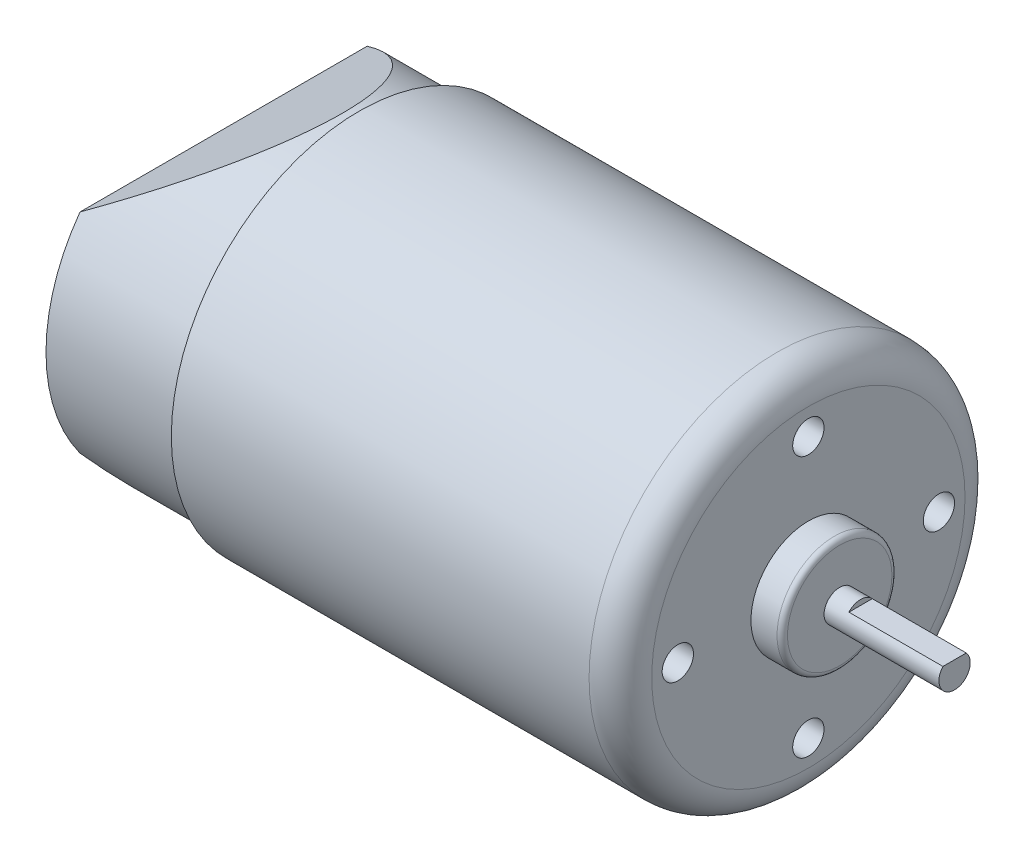
ISO-10303-21;
HEADER;
FILE_DESCRIPTION(('STEP AP214'),'2;1');
FILE_NAME('part.step','',(''),(''),'','','');
FILE_SCHEMA(('AUTOMOTIVE_DESIGN { 1 0 10303 214 1 1 1 1 }'));
ENDSEC;
DATA;
#1=APPLICATION_CONTEXT('core data for automotive mechanical design processes');
#2=APPLICATION_PROTOCOL_DEFINITION('international standard','automotive_design',2000,#1);
#3=PRODUCT_CONTEXT('',#1,'mechanical');
#4=PRODUCT('Part','Part','',(#3));
#5=PRODUCT_RELATED_PRODUCT_CATEGORY('part','',(#4));
#6=PRODUCT_DEFINITION_FORMATION('','',#4);
#7=PRODUCT_DEFINITION_CONTEXT('part definition',#1,'design');
#8=PRODUCT_DEFINITION('design','',#6,#7);
#9=PRODUCT_DEFINITION_SHAPE('','',#8);
#10=(LENGTH_UNIT() NAMED_UNIT(*) SI_UNIT(.MILLI.,.METRE.));
#11=(NAMED_UNIT(*) PLANE_ANGLE_UNIT() SI_UNIT($,.RADIAN.));
#12=(NAMED_UNIT(*) SI_UNIT($,.STERADIAN.) SOLID_ANGLE_UNIT());
#13=UNCERTAINTY_MEASURE_WITH_UNIT(LENGTH_MEASURE(1.E-05),#10,'distance_accuracy_value','');
#14=(GEOMETRIC_REPRESENTATION_CONTEXT(3) GLOBAL_UNCERTAINTY_ASSIGNED_CONTEXT((#13)) GLOBAL_UNIT_ASSIGNED_CONTEXT((#10,
#11,#12)) REPRESENTATION_CONTEXT('',''));
#15=CARTESIAN_POINT('',(0.,0.,0.));
#16=DIRECTION('',(0.,0.,1.));
#17=DIRECTION('',(1.,0.,0.));
#18=AXIS2_PLACEMENT_3D('',#15,#16,#17);
#19=CARTESIAN_POINT('',(59.,0.,0.));
#20=DIRECTION('',(1.,0.,0.));
#21=DIRECTION('',(0.,0.,-1.));
#22=AXIS2_PLACEMENT_3D('',#19,#20,#21);
#23=PLANE('',#22);
#24=CARTESIAN_POINT('',(59.,0.,0.));
#25=DIRECTION('',(1.,0.,0.));
#26=DIRECTION('',(0.,0.,-1.));
#27=AXIS2_PLACEMENT_3D('',#24,#25,#26);
#28=CIRCLE('',#27,5.);
#29=CARTESIAN_POINT('',(59.,0.,-5.));
#30=VERTEX_POINT('',#29);
#31=EDGE_CURVE('E40',#30,#30,#28,.T.);
#32=ORIENTED_EDGE('',*,*,#31,.T.);
#33=EDGE_LOOP('',(#32));
#34=FACE_BOUND('',#33,.T.);
#35=CARTESIAN_POINT('',(59.,0.,0.));
#36=DIRECTION('',(1.,0.,0.));
#37=DIRECTION('',(0.,0.,-1.));
#38=AXIS2_PLACEMENT_3D('',#35,#36,#37);
#39=CIRCLE('',#38,1.5);
#40=CARTESIAN_POINT('',(59.,0.,-1.5));
#41=VERTEX_POINT('',#40);
#42=EDGE_CURVE('E97',#41,#41,#39,.T.);
#43=ORIENTED_EDGE('',*,*,#42,.F.);
#44=EDGE_LOOP('',(#43));
#45=FACE_BOUND('',#44,.T.);
#46=ADVANCED_FACE('F32',(#34,#45),#23,.T.);
#47=CARTESIAN_POINT('',(56.,0.,0.));
#48=DIRECTION('',(1.,0.,0.));
#49=DIRECTION('',(0.,0.,-1.));
#50=AXIS2_PLACEMENT_3D('',#47,#48,#49);
#51=PLANE('',#50);
#52=CARTESIAN_POINT('',(56.,1.30930626041602E-13,12.5));
#53=DIRECTION('',(1.,0.,0.));
#54=DIRECTION('',(0.,0.,-1.));
#55=AXIS2_PLACEMENT_3D('',#52,#53,#54);
#56=CIRCLE('',#55,1.5);
#57=CARTESIAN_POINT('',(56.,1.30930626041602E-13,11.));
#58=VERTEX_POINT('',#57);
#59=EDGE_CURVE('E356',#58,#58,#56,.T.);
#60=ORIENTED_EDGE('',*,*,#59,.F.);
#61=EDGE_LOOP('',(#60));
#62=FACE_BOUND('',#61,.T.);
#63=CARTESIAN_POINT('',(56.,-12.5,0.));
#64=DIRECTION('',(1.,0.,0.));
#65=DIRECTION('',(0.,0.,-1.));
#66=AXIS2_PLACEMENT_3D('',#63,#64,#65);
#67=CIRCLE('',#66,1.5);
#68=CARTESIAN_POINT('',(56.,-12.5,-1.49999999999991));
#69=VERTEX_POINT('',#68);
#70=EDGE_CURVE('E355',#69,#69,#67,.T.);
#71=ORIENTED_EDGE('',*,*,#70,.F.);
#72=EDGE_LOOP('',(#71));
#73=FACE_BOUND('',#72,.T.);
#74=CARTESIAN_POINT('',(56.,0.,-12.5));
#75=DIRECTION('',(1.,0.,0.));
#76=DIRECTION('',(0.,0.,-1.));
#77=AXIS2_PLACEMENT_3D('',#74,#75,#76);
#78=CIRCLE('',#77,1.5);
#79=CARTESIAN_POINT('',(56.,0.,-14.));
#80=VERTEX_POINT('',#79);
#81=EDGE_CURVE('E365',#80,#80,#78,.T.);
#82=ORIENTED_EDGE('',*,*,#81,.F.);
#83=EDGE_LOOP('',(#82));
#84=FACE_BOUND('',#83,.T.);
#85=CARTESIAN_POINT('',(56.,12.5,0.));
#86=DIRECTION('',(1.,0.,0.));
#87=DIRECTION('',(0.,0.,-1.));
#88=AXIS2_PLACEMENT_3D('',#85,#86,#87);
#89=CIRCLE('',#88,1.5);
#90=CARTESIAN_POINT('',(56.,12.5,-1.5));
#91=VERTEX_POINT('',#90);
#92=EDGE_CURVE('E93',#91,#91,#89,.T.);
#93=ORIENTED_EDGE('',*,*,#92,.F.);
#94=EDGE_LOOP('',(#93));
#95=FACE_BOUND('',#94,.T.);
#96=CARTESIAN_POINT('',(56.,0.,0.));
#97=DIRECTION('',(1.,0.,0.));
#98=DIRECTION('',(0.,0.,-1.));
#99=AXIS2_PLACEMENT_3D('',#96,#97,#98);
#100=CIRCLE('',#99,15.);
#101=CARTESIAN_POINT('',(56.,0.,-15.));
#102=VERTEX_POINT('',#101);
#103=EDGE_CURVE('E119',#102,#102,#100,.T.);
#104=ORIENTED_EDGE('',*,*,#103,.T.);
#105=EDGE_LOOP('',(#104));
#106=FACE_BOUND('',#105,.T.);
#107=CARTESIAN_POINT('',(56.,0.,0.));
#108=DIRECTION('',(1.,0.,0.));
#109=DIRECTION('',(0.,0.,-1.));
#110=AXIS2_PLACEMENT_3D('',#107,#108,#109);
#111=CIRCLE('',#110,5.5);
#112=CARTESIAN_POINT('',(56.,0.,-5.5));
#113=VERTEX_POINT('',#112);
#114=EDGE_CURVE('E100',#113,#113,#111,.T.);
#115=ORIENTED_EDGE('',*,*,#114,.F.);
#116=EDGE_LOOP('',(#115));
#117=FACE_BOUND('',#116,.T.);
#118=ADVANCED_FACE('F147',(#62,#73,#84,#95,#106,#117),#51,.T.);
#119=CARTESIAN_POINT('',(56.,0.,0.));
#120=DIRECTION('',(-1.,0.,0.));
#121=DIRECTION('',(0.,0.,1.));
#122=AXIS2_PLACEMENT_3D('',#119,#120,#121);
#123=CYLINDRICAL_SURFACE('',#122,18.);
#124=CARTESIAN_POINT('',(53.,0.,0.));
#125=DIRECTION('',(1.,0.,0.));
#126=DIRECTION('',(0.,0.,-1.));
#127=AXIS2_PLACEMENT_3D('',#124,#125,#126);
#128=CIRCLE('',#127,18.);
#129=CARTESIAN_POINT('',(53.,0.,-18.));
#130=VERTEX_POINT('',#129);
#131=EDGE_CURVE('E124',#130,#130,#128,.F.);
#132=ORIENTED_EDGE('',*,*,#131,.T.);
#133=EDGE_LOOP('',(#132));
#134=FACE_BOUND('',#133,.T.);
#135=CARTESIAN_POINT('',(12.9999999999999,0.,0.));
#136=DIRECTION('',(-1.,0.,0.));
#137=DIRECTION('',(0.,0.,1.));
#138=AXIS2_PLACEMENT_3D('',#135,#136,#137);
#139=CIRCLE('',#138,18.);
#140=CARTESIAN_POINT('',(12.9999999999999,0.,18.));
#141=VERTEX_POINT('',#140);
#142=EDGE_CURVE('E110',#141,#141,#139,.T.);
#143=ORIENTED_EDGE('',*,*,#142,.F.);
#144=EDGE_LOOP('',(#143));
#145=FACE_BOUND('',#144,.T.);
#146=ADVANCED_FACE('F152',(#134,#145),#123,.T.);
#147=CARTESIAN_POINT('',(53.,0.,0.));
#148=DIRECTION('',(1.,0.,0.));
#149=DIRECTION('',(0.,0.,-1.));
#150=AXIS2_PLACEMENT_3D('',#147,#148,#149);
#151=TOROIDAL_SURFACE('',#150,15.,3.);
#152=ORIENTED_EDGE('',*,*,#131,.F.);
#153=EDGE_LOOP('',(#152));
#154=FACE_BOUND('',#153,.T.);
#155=ORIENTED_EDGE('',*,*,#103,.F.);
#156=EDGE_LOOP('',(#155));
#157=FACE_BOUND('',#156,.T.);
#158=ADVANCED_FACE('F161',(#154,#157),#151,.T.);
#159=CARTESIAN_POINT('',(-1000.,0.,0.));
#160=DIRECTION('',(-1.,0.,0.));
#161=DIRECTION('',(0.,0.,1.));
#162=AXIS2_PLACEMENT_3D('',#159,#160,#161);
#163=CYLINDRICAL_SURFACE('',#162,17.);
#164=CARTESIAN_POINT('',(12.9999999999999,0.,0.));
#165=DIRECTION('',(-1.,0.,0.));
#166=DIRECTION('',(0.,0.,1.));
#167=AXIS2_PLACEMENT_3D('',#164,#165,#166);
#168=CIRCLE('',#167,17.);
#169=CARTESIAN_POINT('',(12.9999999999999,0.,17.));
#170=VERTEX_POINT('',#169);
#171=EDGE_CURVE('E107',#170,#170,#168,.T.);
#172=ORIENTED_EDGE('',*,*,#171,.T.);
#173=EDGE_LOOP('',(#172));
#174=FACE_BOUND('',#173,.T.);
#175=CARTESIAN_POINT('',(-16.2499999999999,0.,0.));
#176=DIRECTION('',(0.524097425664335,-0.851658316704544,0.));
#177=DIRECTION('',(-0.851658316704544,-0.524097425664335,0.));
#178=AXIS2_PLACEMENT_3D('',#175,#176,#177);
#179=ELLIPSE('',#178,32.4367172352567,17.);
#180=CARTESIAN_POINT('',(0.,10.,-13.7477270848675));
#181=VERTEX_POINT('',#180);
#182=CARTESIAN_POINT('',(0.,10.,13.7477270848675));
#183=VERTEX_POINT('',#182);
#184=EDGE_CURVE('E113',#181,#183,#179,.T.);
#185=ORIENTED_EDGE('',*,*,#184,.T.);
#186=CARTESIAN_POINT('',(0.,0.,0.));
#187=DIRECTION('',(-1.,0.,0.));
#188=DIRECTION('',(0.,0.,1.));
#189=AXIS2_PLACEMENT_3D('',#186,#187,#188);
#190=CIRCLE('',#189,17.);
#191=CARTESIAN_POINT('',(0.,-10.,13.7477270848675));
#192=VERTEX_POINT('',#191);
#193=EDGE_CURVE('E55',#192,#183,#190,.T.);
#194=ORIENTED_EDGE('',*,*,#193,.F.);
#195=CARTESIAN_POINT('',(-16.2499999999999,0.,0.));
#196=DIRECTION('',(0.524097425664335,0.851658316704544,0.));
#197=DIRECTION('',(-0.851658316704544,0.524097425664335,0.));
#198=AXIS2_PLACEMENT_3D('',#195,#196,#197);
#199=ELLIPSE('',#198,32.4367172352567,17.);
#200=CARTESIAN_POINT('',(0.,-10.,-13.7477270848675));
#201=VERTEX_POINT('',#200);
#202=EDGE_CURVE('E127',#192,#201,#199,.T.);
#203=ORIENTED_EDGE('',*,*,#202,.T.);
#204=EDGE_CURVE('E106',#181,#201,#190,.T.);
#205=ORIENTED_EDGE('',*,*,#204,.F.);
#206=EDGE_LOOP('',(#185,#194,#203,#205));
#207=FACE_BOUND('',#206,.T.);
#208=ADVANCED_FACE('F157',(#174,#207),#163,.T.);
#209=CARTESIAN_POINT('',(13.,18.,0.));
#210=DIRECTION('',(-1.,0.,0.));
#211=DIRECTION('',(0.,0.,1.));
#212=AXIS2_PLACEMENT_3D('',#209,#210,#211);
#213=PLANE('',#212);
#214=ORIENTED_EDGE('',*,*,#142,.T.);
#215=EDGE_LOOP('',(#214));
#216=FACE_BOUND('',#215,.T.);
#217=ORIENTED_EDGE('',*,*,#171,.F.);
#218=EDGE_LOOP('',(#217));
#219=FACE_BOUND('',#218,.T.);
#220=ADVANCED_FACE('F160',(#216,#219),#213,.T.);
#221=CARTESIAN_POINT('',(0.,-10.,-18.001));
#222=DIRECTION('',(0.524097425664335,0.851658316704544,0.));
#223=DIRECTION('',(-0.851658316704544,0.524097425664335,0.));
#224=AXIS2_PLACEMENT_3D('',#221,#222,#223);
#225=PLANE('',#224);
#226=ORIENTED_EDGE('',*,*,#202,.F.);
#227=DIRECTION('',(0.,0.,1.));
#228=VECTOR('',#227,1.);
#229=CARTESIAN_POINT('',(0.,-10.,-18.001));
#230=LINE('',#229,#228);
#231=EDGE_CURVE('E115',#201,#192,#230,.T.);
#232=ORIENTED_EDGE('',*,*,#231,.F.);
#233=EDGE_LOOP('',(#226,#232));
#234=FACE_BOUND('',#233,.T.);
#235=ADVANCED_FACE('F165',(#234),#225,.F.);
#236=CARTESIAN_POINT('',(13.,18.,-18.001));
#237=DIRECTION('',(0.524097425664335,-0.851658316704544,0.));
#238=DIRECTION('',(0.851658316704544,0.524097425664335,0.));
#239=AXIS2_PLACEMENT_3D('',#236,#237,#238);
#240=PLANE('',#239);
#241=ORIENTED_EDGE('',*,*,#184,.F.);
#242=DIRECTION('',(0.,0.,1.));
#243=VECTOR('',#242,1.);
#244=CARTESIAN_POINT('',(0.,10.,-18.001));
#245=LINE('',#244,#243);
#246=EDGE_CURVE('E116',#181,#183,#245,.T.);
#247=ORIENTED_EDGE('',*,*,#246,.T.);
#248=EDGE_LOOP('',(#241,#247));
#249=FACE_BOUND('',#248,.T.);
#250=ADVANCED_FACE('F167',(#249),#240,.F.);
#251=CARTESIAN_POINT('',(0.,0.,0.));
#252=DIRECTION('',(1.,0.,0.));
#253=DIRECTION('',(0.,0.,-1.));
#254=AXIS2_PLACEMENT_3D('',#251,#252,#253);
#255=PLANE('',#254);
#256=ORIENTED_EDGE('',*,*,#193,.T.);
#257=ORIENTED_EDGE('',*,*,#246,.F.);
#258=ORIENTED_EDGE('',*,*,#204,.T.);
#259=ORIENTED_EDGE('',*,*,#231,.T.);
#260=EDGE_LOOP('',(#256,#257,#258,#259));
#261=FACE_BOUND('',#260,.T.);
#262=ADVANCED_FACE('F142',(#261),#255,.F.);
#263=CARTESIAN_POINT('',(59.,0.,0.));
#264=DIRECTION('',(-1.,0.,0.));
#265=DIRECTION('',(0.,0.,1.));
#266=AXIS2_PLACEMENT_3D('',#263,#264,#265);
#267=CYLINDRICAL_SURFACE('',#266,5.5);
#268=CARTESIAN_POINT('',(58.5,0.,0.));
#269=DIRECTION('',(1.,0.,0.));
#270=DIRECTION('',(0.,0.,-1.));
#271=AXIS2_PLACEMENT_3D('',#268,#269,#270);
#272=CIRCLE('',#271,5.5);
#273=CARTESIAN_POINT('',(58.5,0.,-5.5));
#274=VERTEX_POINT('',#273);
#275=EDGE_CURVE('E11',#274,#274,#272,.F.);
#276=ORIENTED_EDGE('',*,*,#275,.T.);
#277=EDGE_LOOP('',(#276));
#278=FACE_BOUND('',#277,.T.);
#279=ORIENTED_EDGE('',*,*,#114,.T.);
#280=EDGE_LOOP('',(#279));
#281=FACE_BOUND('',#280,.T.);
#282=ADVANCED_FACE('F134',(#278,#281),#267,.T.);
#283=CARTESIAN_POINT('',(58.5,0.,0.));
#284=DIRECTION('',(1.,0.,0.));
#285=DIRECTION('',(0.,0.,-1.));
#286=AXIS2_PLACEMENT_3D('',#283,#284,#285);
#287=TOROIDAL_SURFACE('',#286,5.,0.5);
#288=ORIENTED_EDGE('',*,*,#275,.F.);
#289=EDGE_LOOP('',(#288));
#290=FACE_BOUND('',#289,.T.);
#291=ORIENTED_EDGE('',*,*,#31,.F.);
#292=EDGE_LOOP('',(#291));
#293=FACE_BOUND('',#292,.T.);
#294=ADVANCED_FACE('F34',(#290,#293),#287,.T.);
#295=CARTESIAN_POINT('',(70.,0.,0.));
#296=DIRECTION('',(-1.,0.,0.));
#297=DIRECTION('',(0.,0.,1.));
#298=AXIS2_PLACEMENT_3D('',#295,#296,#297);
#299=CYLINDRICAL_SURFACE('',#298,1.5);
#300=CARTESIAN_POINT('',(70.,0.,0.));
#301=DIRECTION('',(1.,0.,0.));
#302=DIRECTION('',(0.,0.,-1.));
#303=AXIS2_PLACEMENT_3D('',#300,#301,#302);
#304=CIRCLE('',#303,1.5);
#305=CARTESIAN_POINT('',(70.,1.,1.1180339887499));
#306=VERTEX_POINT('',#305);
#307=CARTESIAN_POINT('',(70.,1.,-1.11803398874989));
#308=VERTEX_POINT('',#307);
#309=EDGE_CURVE('E88',#306,#308,#304,.T.);
#310=ORIENTED_EDGE('',*,*,#309,.F.);
#311=DIRECTION('',(-1.,0.,0.));
#312=VECTOR('',#311,1.);
#313=CARTESIAN_POINT('',(70.,1.,1.1180339887499));
#314=LINE('',#313,#312);
#315=CARTESIAN_POINT('',(61.,0.999999999999999,1.1180339887499));
#316=VERTEX_POINT('',#315);
#317=EDGE_CURVE('E47',#306,#316,#314,.T.);
#318=ORIENTED_EDGE('',*,*,#317,.T.);
#319=CARTESIAN_POINT('',(61.,0.,0.));
#320=DIRECTION('',(-1.,0.,0.));
#321=DIRECTION('',(0.,0.,1.));
#322=AXIS2_PLACEMENT_3D('',#319,#320,#321);
#323=CIRCLE('',#322,1.5);
#324=CARTESIAN_POINT('',(61.,0.999999999999999,-1.1180339887499));
#325=VERTEX_POINT('',#324);
#326=EDGE_CURVE('E74',#325,#316,#323,.F.);
#327=ORIENTED_EDGE('',*,*,#326,.F.);
#328=DIRECTION('',(-1.,0.,0.));
#329=VECTOR('',#328,1.);
#330=CARTESIAN_POINT('',(70.,1.,-1.1180339887499));
#331=LINE('',#330,#329);
#332=EDGE_CURVE('E79',#308,#325,#331,.T.);
#333=ORIENTED_EDGE('',*,*,#332,.F.);
#334=EDGE_LOOP('',(#310,#318,#327,#333));
#335=FACE_BOUND('',#334,.T.);
#336=ORIENTED_EDGE('',*,*,#42,.T.);
#337=EDGE_LOOP('',(#336));
#338=FACE_BOUND('',#337,.T.);
#339=ADVANCED_FACE('F85',(#335,#338),#299,.T.);
#340=CARTESIAN_POINT('',(70.,0.,0.));
#341=DIRECTION('',(1.,0.,0.));
#342=DIRECTION('',(0.,0.,-1.));
#343=AXIS2_PLACEMENT_3D('',#340,#341,#342);
#344=PLANE('',#343);
#345=DIRECTION('',(0.,0.,1.));
#346=VECTOR('',#345,1.);
#347=CARTESIAN_POINT('',(70.,1.,-18.001));
#348=LINE('',#347,#346);
#349=EDGE_CURVE('E82',#308,#306,#348,.T.);
#350=ORIENTED_EDGE('',*,*,#349,.T.);
#351=ORIENTED_EDGE('',*,*,#309,.T.);
#352=EDGE_LOOP('',(#350,#351));
#353=FACE_BOUND('',#352,.T.);
#354=ADVANCED_FACE('F140',(#353),#344,.T.);
#355=CARTESIAN_POINT('',(61.,0.999999999999999,-18.001));
#356=DIRECTION('',(-1.,0.,0.));
#357=DIRECTION('',(0.,0.,1.));
#358=AXIS2_PLACEMENT_3D('',#355,#356,#357);
#359=PLANE('',#358);
#360=ORIENTED_EDGE('',*,*,#326,.T.);
#361=DIRECTION('',(0.,0.,1.));
#362=VECTOR('',#361,1.);
#363=CARTESIAN_POINT('',(61.,0.999999999999999,-18.001));
#364=LINE('',#363,#362);
#365=EDGE_CURVE('E76',#325,#316,#364,.T.);
#366=ORIENTED_EDGE('',*,*,#365,.F.);
#367=EDGE_LOOP('',(#360,#366));
#368=FACE_BOUND('',#367,.T.);
#369=ADVANCED_FACE('F75',(#368),#359,.F.);
#370=CARTESIAN_POINT('',(70.,1.,-18.001));
#371=DIRECTION('',(0.,-1.,0.));
#372=DIRECTION('',(1.,0.,0.));
#373=AXIS2_PLACEMENT_3D('',#370,#371,#372);
#374=PLANE('',#373);
#375=ORIENTED_EDGE('',*,*,#332,.T.);
#376=ORIENTED_EDGE('',*,*,#365,.T.);
#377=ORIENTED_EDGE('',*,*,#317,.F.);
#378=ORIENTED_EDGE('',*,*,#349,.F.);
#379=EDGE_LOOP('',(#375,#376,#377,#378));
#380=FACE_BOUND('',#379,.T.);
#381=ADVANCED_FACE('F81',(#380),#374,.F.);
#382=CARTESIAN_POINT('',(53.,12.5,0.));
#383=DIRECTION('',(1.,0.,0.));
#384=DIRECTION('',(0.,0.,-1.));
#385=AXIS2_PLACEMENT_3D('',#382,#383,#384);
#386=CYLINDRICAL_SURFACE('',#385,1.5);
#387=CARTESIAN_POINT('',(53.,12.5,0.));
#388=DIRECTION('',(1.,0.,0.));
#389=DIRECTION('',(0.,0.,-1.));
#390=AXIS2_PLACEMENT_3D('',#387,#388,#389);
#391=CIRCLE('',#390,1.5);
#392=CARTESIAN_POINT('',(53.,12.5,-1.5));
#393=VERTEX_POINT('',#392);
#394=EDGE_CURVE('E89',#393,#393,#391,.T.);
#395=ORIENTED_EDGE('',*,*,#394,.F.);
#396=EDGE_LOOP('',(#395));
#397=FACE_BOUND('',#396,.T.);
#398=ORIENTED_EDGE('',*,*,#92,.T.);
#399=EDGE_LOOP('',(#398));
#400=FACE_BOUND('',#399,.T.);
#401=ADVANCED_FACE('F264',(#397,#400),#386,.F.);
#402=CARTESIAN_POINT('',(53.,12.5,0.));
#403=DIRECTION('',(1.,0.,0.));
#404=DIRECTION('',(0.,0.,-1.));
#405=AXIS2_PLACEMENT_3D('',#402,#403,#404);
#406=PLANE('',#405);
#407=ORIENTED_EDGE('',*,*,#394,.T.);
#408=EDGE_LOOP('',(#407));
#409=FACE_BOUND('',#408,.T.);
#410=ADVANCED_FACE('F278',(#409),#406,.T.);
#411=CARTESIAN_POINT('',(53.,0.,-12.5));
#412=DIRECTION('',(1.,0.,0.));
#413=DIRECTION('',(0.,0.,-1.));
#414=AXIS2_PLACEMENT_3D('',#411,#412,#413);
#415=CYLINDRICAL_SURFACE('',#414,1.5);
#416=CARTESIAN_POINT('',(53.,0.,-12.5));
#417=DIRECTION('',(1.,0.,0.));
#418=DIRECTION('',(0.,0.,-1.));
#419=AXIS2_PLACEMENT_3D('',#416,#417,#418);
#420=CIRCLE('',#419,1.5);
#421=CARTESIAN_POINT('',(53.,0.,-14.));
#422=VERTEX_POINT('',#421);
#423=EDGE_CURVE('E367',#422,#422,#420,.T.);
#424=ORIENTED_EDGE('',*,*,#423,.F.);
#425=EDGE_LOOP('',(#424));
#426=FACE_BOUND('',#425,.T.);
#427=ORIENTED_EDGE('',*,*,#81,.T.);
#428=EDGE_LOOP('',(#427));
#429=FACE_BOUND('',#428,.T.);
#430=ADVANCED_FACE('F288',(#426,#429),#415,.F.);
#431=CARTESIAN_POINT('',(53.,0.,-12.5));
#432=DIRECTION('',(1.,0.,0.));
#433=DIRECTION('',(0.,0.,-1.));
#434=AXIS2_PLACEMENT_3D('',#431,#432,#433);
#435=PLANE('',#434);
#436=ORIENTED_EDGE('',*,*,#423,.T.);
#437=EDGE_LOOP('',(#436));
#438=FACE_BOUND('',#437,.T.);
#439=ADVANCED_FACE('F298',(#438),#435,.T.);
#440=CARTESIAN_POINT('',(53.,-12.5,0.));
#441=DIRECTION('',(1.,0.,0.));
#442=DIRECTION('',(0.,0.,-1.));
#443=AXIS2_PLACEMENT_3D('',#440,#441,#442);
#444=CYLINDRICAL_SURFACE('',#443,1.5);
#445=CARTESIAN_POINT('',(53.,-12.5,0.));
#446=DIRECTION('',(1.,0.,0.));
#447=DIRECTION('',(0.,0.,-1.));
#448=AXIS2_PLACEMENT_3D('',#445,#446,#447);
#449=CIRCLE('',#448,1.5);
#450=CARTESIAN_POINT('',(53.,-12.5,-1.49999999999991));
#451=VERTEX_POINT('',#450);
#452=EDGE_CURVE('E359',#451,#451,#449,.T.);
#453=ORIENTED_EDGE('',*,*,#452,.F.);
#454=EDGE_LOOP('',(#453));
#455=FACE_BOUND('',#454,.T.);
#456=ORIENTED_EDGE('',*,*,#70,.T.);
#457=EDGE_LOOP('',(#456));
#458=FACE_BOUND('',#457,.T.);
#459=ADVANCED_FACE('F308',(#455,#458),#444,.F.);
#460=CARTESIAN_POINT('',(53.,-12.5,0.));
#461=DIRECTION('',(1.,0.,0.));
#462=DIRECTION('',(0.,0.,-1.));
#463=AXIS2_PLACEMENT_3D('',#460,#461,#462);
#464=PLANE('',#463);
#465=ORIENTED_EDGE('',*,*,#452,.T.);
#466=EDGE_LOOP('',(#465));
#467=FACE_BOUND('',#466,.T.);
#468=ADVANCED_FACE('F318',(#467),#464,.T.);
#469=CARTESIAN_POINT('',(53.,1.30930626041602E-13,12.5));
#470=DIRECTION('',(1.,0.,0.));
#471=DIRECTION('',(0.,0.,-1.));
#472=AXIS2_PLACEMENT_3D('',#469,#470,#471);
#473=CYLINDRICAL_SURFACE('',#472,1.5);
#474=CARTESIAN_POINT('',(53.,1.30930626041602E-13,12.5));
#475=DIRECTION('',(1.,0.,0.));
#476=DIRECTION('',(0.,0.,-1.));
#477=AXIS2_PLACEMENT_3D('',#474,#475,#476);
#478=CIRCLE('',#477,1.5);
#479=CARTESIAN_POINT('',(53.,1.30930626041602E-13,11.));
#480=VERTEX_POINT('',#479);
#481=EDGE_CURVE('E354',#480,#480,#478,.T.);
#482=ORIENTED_EDGE('',*,*,#481,.F.);
#483=EDGE_LOOP('',(#482));
#484=FACE_BOUND('',#483,.T.);
#485=ORIENTED_EDGE('',*,*,#59,.T.);
#486=EDGE_LOOP('',(#485));
#487=FACE_BOUND('',#486,.T.);
#488=ADVANCED_FACE('F328',(#484,#487),#473,.F.);
#489=CARTESIAN_POINT('',(53.,1.30930626041602E-13,12.5));
#490=DIRECTION('',(1.,0.,0.));
#491=DIRECTION('',(0.,0.,-1.));
#492=AXIS2_PLACEMENT_3D('',#489,#490,#491);
#493=PLANE('',#492);
#494=ORIENTED_EDGE('',*,*,#481,.T.);
#495=EDGE_LOOP('',(#494));
#496=FACE_BOUND('',#495,.T.);
#497=ADVANCED_FACE('F338',(#496),#493,.T.);
#498=CLOSED_SHELL('',(#46,#118,#146,#158,#208,#220,#235,#250,#262,#282,#294,#339,#354,#369,#381,
#401,#410,#430,#439,#459,#468,#488,#497));
#499=MANIFOLD_SOLID_BREP('B2',#498);
#500=ADVANCED_BREP_SHAPE_REPRESENTATION('',(#18,#499),#14);
#501=SHAPE_DEFINITION_REPRESENTATION(#9,#500);
ENDSEC;
END-ISO-10303-21;
